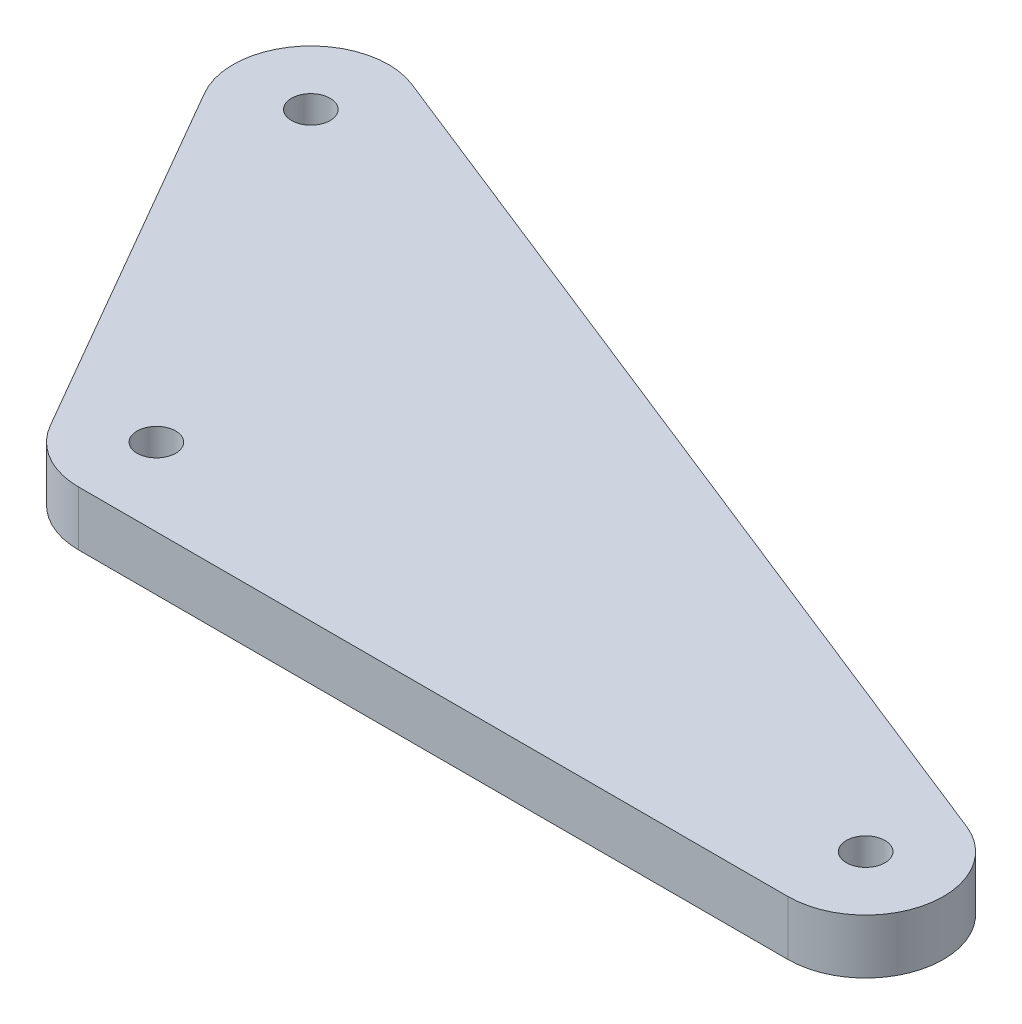
ISO-10303-21;
HEADER;
FILE_DESCRIPTION(('STEP AP214'),'2;1');
FILE_NAME('part.step','',(''),(''),'','','');
FILE_SCHEMA(('AUTOMOTIVE_DESIGN { 1 0 10303 214 1 1 1 1 }'));
ENDSEC;
DATA;
#1=APPLICATION_CONTEXT('core data for automotive mechanical design processes');
#2=APPLICATION_PROTOCOL_DEFINITION('international standard','automotive_design',2000,#1);
#3=PRODUCT_CONTEXT('',#1,'mechanical');
#4=PRODUCT('Part','Part','',(#3));
#5=PRODUCT_RELATED_PRODUCT_CATEGORY('part','',(#4));
#6=PRODUCT_DEFINITION_FORMATION('','',#4);
#7=PRODUCT_DEFINITION_CONTEXT('part definition',#1,'design');
#8=PRODUCT_DEFINITION('design','',#6,#7);
#9=PRODUCT_DEFINITION_SHAPE('','',#8);
#10=(LENGTH_UNIT() NAMED_UNIT(*) SI_UNIT(.MILLI.,.METRE.));
#11=(NAMED_UNIT(*) PLANE_ANGLE_UNIT() SI_UNIT($,.RADIAN.));
#12=(NAMED_UNIT(*) SI_UNIT($,.STERADIAN.) SOLID_ANGLE_UNIT());
#13=UNCERTAINTY_MEASURE_WITH_UNIT(LENGTH_MEASURE(1.E-05),#10,'distance_accuracy_value','');
#14=(GEOMETRIC_REPRESENTATION_CONTEXT(3) GLOBAL_UNCERTAINTY_ASSIGNED_CONTEXT((#13)) GLOBAL_UNIT_ASSIGNED_CONTEXT((#10,
#11,#12)) REPRESENTATION_CONTEXT('',''));
#15=CARTESIAN_POINT('',(0.,0.,0.));
#16=DIRECTION('',(0.,0.,1.));
#17=DIRECTION('',(1.,0.,0.));
#18=AXIS2_PLACEMENT_3D('',#15,#16,#17);
#19=CARTESIAN_POINT('',(-107.101555281038,6.35,-42.5245411515933));
#20=DIRECTION('',(0.,-1.,0.));
#21=DIRECTION('',(0.,0.,-1.));
#22=AXIS2_PLACEMENT_3D('',#19,#20,#21);
#23=CYLINDRICAL_SURFACE('',#22,9.04875);
#24=CARTESIAN_POINT('',(-107.101555281038,0.,-42.5245411515933));
#25=DIRECTION('',(0.,1.,0.));
#26=DIRECTION('',(0.,0.,1.));
#27=AXIS2_PLACEMENT_3D('',#24,#25,#26);
#28=CIRCLE('',#27,9.04875);
#29=CARTESIAN_POINT('',(-103.762341405601,0.,-50.9346260058974));
#30=VERTEX_POINT('',#29);
#31=CARTESIAN_POINT('',(-114.938002653532,0.,-38.0001661515934));
#32=VERTEX_POINT('',#31);
#33=EDGE_CURVE('E122',#30,#32,#28,.T.);
#34=ORIENTED_EDGE('',*,*,#33,.T.);
#35=DIRECTION('',(0.,-1.,0.));
#36=VECTOR('',#35,1.);
#37=CARTESIAN_POINT('',(-114.938002653532,6.35,-38.0001661515934));
#38=LINE('',#37,#36);
#39=CARTESIAN_POINT('',(-114.938002653532,6.35,-38.0001661515934));
#40=VERTEX_POINT('',#39);
#41=EDGE_CURVE('E11',#40,#32,#38,.T.);
#42=ORIENTED_EDGE('',*,*,#41,.F.);
#43=CARTESIAN_POINT('',(-107.101555281038,6.35,-42.5245411515933));
#44=DIRECTION('',(0.,1.,0.));
#45=DIRECTION('',(0.,0.,1.));
#46=AXIS2_PLACEMENT_3D('',#43,#44,#45);
#47=CIRCLE('',#46,9.04875);
#48=CARTESIAN_POINT('',(-103.762341405601,6.35,-50.9346260058974));
#49=VERTEX_POINT('',#48);
#50=EDGE_CURVE('E133',#49,#40,#47,.T.);
#51=ORIENTED_EDGE('',*,*,#50,.F.);
#52=DIRECTION('',(0.,-1.,0.));
#53=VECTOR('',#52,1.);
#54=CARTESIAN_POINT('',(-103.762341405601,6.35,-50.9346260058974));
#55=LINE('',#54,#53);
#56=EDGE_CURVE('E118',#49,#30,#55,.T.);
#57=ORIENTED_EDGE('',*,*,#56,.T.);
#58=EDGE_LOOP('',(#34,#42,#51,#57));
#59=FACE_BOUND('',#58,.T.);
#60=ADVANCED_FACE('F38',(#59),#23,.T.);
#61=CARTESIAN_POINT('',(-114.938002653532,6.35,-38.0001661515934));
#62=DIRECTION('',(0.86602540378444,0.,-0.499999999999997));
#63=DIRECTION('',(-0.499999999999998,0.,-0.86602540378444));
#64=AXIS2_PLACEMENT_3D('',#61,#62,#63);
#65=PLANE('',#64);
#66=DIRECTION('',(0.499999999999997,0.,0.86602540378444));
#67=VECTOR('',#66,1.);
#68=CARTESIAN_POINT('',(-114.938002653532,0.,-38.0001661515934));
#69=LINE('',#68,#67);
#70=CARTESIAN_POINT('',(-90.3864473724945,0.,4.52437499999998));
#71=VERTEX_POINT('',#70);
#72=EDGE_CURVE('E125',#32,#71,#69,.T.);
#73=ORIENTED_EDGE('',*,*,#72,.T.);
#74=DIRECTION('',(0.,-1.,0.));
#75=VECTOR('',#74,1.);
#76=CARTESIAN_POINT('',(-90.3864473724945,6.35,4.52437499999998));
#77=LINE('',#76,#75);
#78=CARTESIAN_POINT('',(-90.3864473724945,6.35,4.52437499999998));
#79=VERTEX_POINT('',#78);
#80=EDGE_CURVE('E46',#79,#71,#77,.T.);
#81=ORIENTED_EDGE('',*,*,#80,.F.);
#82=DIRECTION('',(0.499999999999997,0.,0.86602540378444));
#83=VECTOR('',#82,1.);
#84=CARTESIAN_POINT('',(-114.938002653532,6.35,-38.0001661515934));
#85=LINE('',#84,#83);
#86=EDGE_CURVE('E91',#40,#79,#85,.T.);
#87=ORIENTED_EDGE('',*,*,#86,.F.);
#88=ORIENTED_EDGE('',*,*,#41,.T.);
#89=EDGE_LOOP('',(#73,#81,#87,#88));
#90=FACE_BOUND('',#89,.T.);
#91=ADVANCED_FACE('F158',(#90),#65,.F.);
#92=CARTESIAN_POINT('',(-82.55,6.35,0.));
#93=DIRECTION('',(0.,-1.,0.));
#94=DIRECTION('',(0.,0.,-1.));
#95=AXIS2_PLACEMENT_3D('',#92,#93,#94);
#96=CYLINDRICAL_SURFACE('',#95,9.04875000000001);
#97=CARTESIAN_POINT('',(-82.55,0.,0.));
#98=DIRECTION('',(0.,1.,0.));
#99=DIRECTION('',(0.,0.,1.));
#100=AXIS2_PLACEMENT_3D('',#97,#98,#99);
#101=CIRCLE('',#100,9.04875000000001);
#102=CARTESIAN_POINT('',(-82.55,0.,9.04875000000001));
#103=VERTEX_POINT('',#102);
#104=EDGE_CURVE('E128',#71,#103,#101,.T.);
#105=ORIENTED_EDGE('',*,*,#104,.T.);
#106=DIRECTION('',(0.,-1.,0.));
#107=VECTOR('',#106,1.);
#108=CARTESIAN_POINT('',(-82.55,6.35,9.04875000000001));
#109=LINE('',#108,#107);
#110=CARTESIAN_POINT('',(-82.55,6.35,9.04875000000001));
#111=VERTEX_POINT('',#110);
#112=EDGE_CURVE('E113',#111,#103,#109,.T.);
#113=ORIENTED_EDGE('',*,*,#112,.F.);
#114=CARTESIAN_POINT('',(-82.55,6.35,0.));
#115=DIRECTION('',(0.,1.,0.));
#116=DIRECTION('',(0.,0.,1.));
#117=AXIS2_PLACEMENT_3D('',#114,#115,#116);
#118=CIRCLE('',#117,9.04875000000001);
#119=EDGE_CURVE('E104',#79,#111,#118,.T.);
#120=ORIENTED_EDGE('',*,*,#119,.F.);
#121=ORIENTED_EDGE('',*,*,#80,.T.);
#122=EDGE_LOOP('',(#105,#113,#120,#121));
#123=FACE_BOUND('',#122,.T.);
#124=ADVANCED_FACE('F139',(#123),#96,.T.);
#125=CARTESIAN_POINT('',(-82.55,6.35,9.04875000000001));
#126=DIRECTION('',(0.,0.,-1.));
#127=DIRECTION('',(-1.,0.,0.));
#128=AXIS2_PLACEMENT_3D('',#125,#126,#127);
#129=PLANE('',#128);
#130=DIRECTION('',(1.,0.,0.));
#131=VECTOR('',#130,1.);
#132=CARTESIAN_POINT('',(-82.55,0.,9.04875000000001));
#133=LINE('',#132,#131);
#134=CARTESIAN_POINT('',(-1.70841119029318E-13,0.,9.04874999999996));
#135=VERTEX_POINT('',#134);
#136=EDGE_CURVE('E112',#103,#135,#133,.T.);
#137=ORIENTED_EDGE('',*,*,#136,.T.);
#138=DIRECTION('',(0.,-1.,0.));
#139=VECTOR('',#138,1.);
#140=CARTESIAN_POINT('',(-1.70841119029318E-13,6.35,9.04874999999996));
#141=LINE('',#140,#139);
#142=CARTESIAN_POINT('',(-1.70841119029318E-13,6.35,9.04874999999996));
#143=VERTEX_POINT('',#142);
#144=EDGE_CURVE('E109',#143,#135,#141,.T.);
#145=ORIENTED_EDGE('',*,*,#144,.F.);
#146=DIRECTION('',(1.,0.,0.));
#147=VECTOR('',#146,1.);
#148=CARTESIAN_POINT('',(-82.55,6.35,9.04875000000001));
#149=LINE('',#148,#147);
#150=EDGE_CURVE('E98',#111,#143,#149,.T.);
#151=ORIENTED_EDGE('',*,*,#150,.F.);
#152=ORIENTED_EDGE('',*,*,#112,.T.);
#153=EDGE_LOOP('',(#137,#145,#151,#152));
#154=FACE_BOUND('',#153,.T.);
#155=ADVANCED_FACE('F110',(#154),#129,.F.);
#156=CARTESIAN_POINT('',(1.90819582357449E-13,6.35,0.));
#157=DIRECTION('',(0.,-1.,0.));
#158=DIRECTION('',(0.,0.,-1.));
#159=AXIS2_PLACEMENT_3D('',#156,#157,#158);
#160=CYLINDRICAL_SURFACE('',#159,9.04874999999997);
#161=CARTESIAN_POINT('',(1.90819582357449E-13,0.,0.));
#162=DIRECTION('',(0.,1.,0.));
#163=DIRECTION('',(0.,0.,1.));
#164=AXIS2_PLACEMENT_3D('',#161,#162,#163);
#165=CIRCLE('',#164,9.04874999999997);
#166=CARTESIAN_POINT('',(3.33921387543626,0.,-8.41008485430403));
#167=VERTEX_POINT('',#166);
#168=EDGE_CURVE('E77',#135,#167,#165,.T.);
#169=ORIENTED_EDGE('',*,*,#168,.T.);
#170=DIRECTION('',(0.,-1.,0.));
#171=VECTOR('',#170,1.);
#172=CARTESIAN_POINT('',(3.33921387543626,6.35,-8.41008485430403));
#173=LINE('',#172,#171);
#174=CARTESIAN_POINT('',(3.33921387543626,6.35,-8.41008485430403));
#175=VERTEX_POINT('',#174);
#176=EDGE_CURVE('E114',#175,#167,#173,.T.);
#177=ORIENTED_EDGE('',*,*,#176,.F.);
#178=CARTESIAN_POINT('',(1.90819582357449E-13,6.35,0.));
#179=DIRECTION('',(0.,1.,0.));
#180=DIRECTION('',(0.,0.,1.));
#181=AXIS2_PLACEMENT_3D('',#178,#179,#180);
#182=CIRCLE('',#181,9.04874999999997);
#183=EDGE_CURVE('E102',#143,#175,#182,.T.);
#184=ORIENTED_EDGE('',*,*,#183,.F.);
#185=ORIENTED_EDGE('',*,*,#144,.T.);
#186=EDGE_LOOP('',(#169,#177,#184,#185));
#187=FACE_BOUND('',#186,.T.);
#188=ADVANCED_FACE('F116',(#187),#160,.T.);
#189=CARTESIAN_POINT('',(-103.762341405601,6.35,-50.9346260058974));
#190=DIRECTION('',(-0.369024879175163,0.,0.929419516983454));
#191=DIRECTION('',(0.929419516983454,0.,0.369024879175163));
#192=AXIS2_PLACEMENT_3D('',#189,#190,#191);
#193=PLANE('',#192);
#194=DIRECTION('',(-0.929419516983454,0.,-0.369024879175163));
#195=VECTOR('',#194,1.);
#196=CARTESIAN_POINT('',(-103.762341405601,0.,-50.9346260058974));
#197=LINE('',#196,#195);
#198=EDGE_CURVE('E83',#167,#30,#197,.T.);
#199=ORIENTED_EDGE('',*,*,#198,.T.);
#200=ORIENTED_EDGE('',*,*,#56,.F.);
#201=DIRECTION('',(-0.929419516983454,0.,-0.369024879175163));
#202=VECTOR('',#201,1.);
#203=CARTESIAN_POINT('',(-103.762341405601,6.35,-50.9346260058974));
#204=LINE('',#203,#202);
#205=EDGE_CURVE('E54',#175,#49,#204,.T.);
#206=ORIENTED_EDGE('',*,*,#205,.F.);
#207=ORIENTED_EDGE('',*,*,#176,.T.);
#208=EDGE_LOOP('',(#199,#200,#206,#207));
#209=FACE_BOUND('',#208,.T.);
#210=ADVANCED_FACE('F146',(#209),#193,.F.);
#211=CARTESIAN_POINT('',(-107.101555281038,6.35,-42.5245411515933));
#212=DIRECTION('',(0.,1.,0.));
#213=DIRECTION('',(0.,0.,1.));
#214=AXIS2_PLACEMENT_3D('',#211,#212,#213);
#215=PLANE('',#214);
#216=CARTESIAN_POINT('',(-107.101555281038,6.35,-42.5245411515933));
#217=DIRECTION('',(0.,1.,0.));
#218=DIRECTION('',(0.,0.,1.));
#219=AXIS2_PLACEMENT_3D('',#216,#217,#218);
#220=CIRCLE('',#219,2.25);
#221=CARTESIAN_POINT('',(-107.101555281038,6.35,-40.2745411515933));
#222=VERTEX_POINT('',#221);
#223=EDGE_CURVE('E234',#222,#222,#220,.T.);
#224=ORIENTED_EDGE('',*,*,#223,.F.);
#225=EDGE_LOOP('',(#224));
#226=FACE_BOUND('',#225,.T.);
#227=CARTESIAN_POINT('',(-82.55,6.35,0.));
#228=DIRECTION('',(0.,1.,0.));
#229=DIRECTION('',(0.,0.,1.));
#230=AXIS2_PLACEMENT_3D('',#227,#228,#229);
#231=CIRCLE('',#230,2.25);
#232=CARTESIAN_POINT('',(-82.55,6.35,2.25));
#233=VERTEX_POINT('',#232);
#234=EDGE_CURVE('E236',#233,#233,#231,.T.);
#235=ORIENTED_EDGE('',*,*,#234,.F.);
#236=EDGE_LOOP('',(#235));
#237=FACE_BOUND('',#236,.T.);
#238=CARTESIAN_POINT('',(0.,6.35,0.));
#239=DIRECTION('',(0.,1.,0.));
#240=DIRECTION('',(0.,0.,1.));
#241=AXIS2_PLACEMENT_3D('',#238,#239,#240);
#242=CIRCLE('',#241,2.25);
#243=CARTESIAN_POINT('',(0.,6.35,2.25));
#244=VERTEX_POINT('',#243);
#245=EDGE_CURVE('E244',#244,#244,#242,.T.);
#246=ORIENTED_EDGE('',*,*,#245,.F.);
#247=EDGE_LOOP('',(#246));
#248=FACE_BOUND('',#247,.T.);
#249=ORIENTED_EDGE('',*,*,#50,.T.);
#250=ORIENTED_EDGE('',*,*,#86,.T.);
#251=ORIENTED_EDGE('',*,*,#119,.T.);
#252=ORIENTED_EDGE('',*,*,#150,.T.);
#253=ORIENTED_EDGE('',*,*,#183,.T.);
#254=ORIENTED_EDGE('',*,*,#205,.T.);
#255=EDGE_LOOP('',(#249,#250,#251,#252,#253,#254));
#256=FACE_BOUND('',#255,.T.);
#257=ADVANCED_FACE('F100',(#226,#237,#248,#256),#215,.T.);
#258=CARTESIAN_POINT('',(-107.101555281038,0.,-42.5245411515933));
#259=DIRECTION('',(0.,1.,0.));
#260=DIRECTION('',(0.,0.,1.));
#261=AXIS2_PLACEMENT_3D('',#258,#259,#260);
#262=PLANE('',#261);
#263=CARTESIAN_POINT('',(-107.101555281038,0.,-42.5245411515933));
#264=DIRECTION('',(0.,1.,0.));
#265=DIRECTION('',(0.,0.,1.));
#266=AXIS2_PLACEMENT_3D('',#263,#264,#265);
#267=CIRCLE('',#266,2.25);
#268=CARTESIAN_POINT('',(-107.101555281038,0.,-40.2745411515933));
#269=VERTEX_POINT('',#268);
#270=EDGE_CURVE('E231',#269,#269,#267,.T.);
#271=ORIENTED_EDGE('',*,*,#270,.T.);
#272=EDGE_LOOP('',(#271));
#273=FACE_BOUND('',#272,.T.);
#274=CARTESIAN_POINT('',(-82.55,0.,0.));
#275=DIRECTION('',(0.,1.,0.));
#276=DIRECTION('',(0.,0.,1.));
#277=AXIS2_PLACEMENT_3D('',#274,#275,#276);
#278=CIRCLE('',#277,2.25);
#279=CARTESIAN_POINT('',(-82.55,0.,2.25));
#280=VERTEX_POINT('',#279);
#281=EDGE_CURVE('E241',#280,#280,#278,.T.);
#282=ORIENTED_EDGE('',*,*,#281,.T.);
#283=EDGE_LOOP('',(#282));
#284=FACE_BOUND('',#283,.T.);
#285=CARTESIAN_POINT('',(0.,0.,0.));
#286=DIRECTION('',(0.,1.,0.));
#287=DIRECTION('',(0.,0.,1.));
#288=AXIS2_PLACEMENT_3D('',#285,#286,#287);
#289=CIRCLE('',#288,2.25);
#290=CARTESIAN_POINT('',(0.,0.,2.25));
#291=VERTEX_POINT('',#290);
#292=EDGE_CURVE('E126',#291,#291,#289,.T.);
#293=ORIENTED_EDGE('',*,*,#292,.T.);
#294=EDGE_LOOP('',(#293));
#295=FACE_BOUND('',#294,.T.);
#296=ORIENTED_EDGE('',*,*,#33,.F.);
#297=ORIENTED_EDGE('',*,*,#198,.F.);
#298=ORIENTED_EDGE('',*,*,#168,.F.);
#299=ORIENTED_EDGE('',*,*,#136,.F.);
#300=ORIENTED_EDGE('',*,*,#104,.F.);
#301=ORIENTED_EDGE('',*,*,#72,.F.);
#302=EDGE_LOOP('',(#296,#297,#298,#299,#300,#301));
#303=FACE_BOUND('',#302,.T.);
#304=ADVANCED_FACE('F142',(#273,#284,#295,#303),#262,.F.);
#305=CARTESIAN_POINT('',(0.,6.35,0.));
#306=DIRECTION('',(0.,1.,0.));
#307=DIRECTION('',(0.,0.,1.));
#308=AXIS2_PLACEMENT_3D('',#305,#306,#307);
#309=CYLINDRICAL_SURFACE('',#308,2.25);
#310=ORIENTED_EDGE('',*,*,#292,.F.);
#311=EDGE_LOOP('',(#310));
#312=FACE_BOUND('',#311,.T.);
#313=ORIENTED_EDGE('',*,*,#245,.T.);
#314=EDGE_LOOP('',(#313));
#315=FACE_BOUND('',#314,.T.);
#316=ADVANCED_FACE('F195',(#312,#315),#309,.F.);
#317=CARTESIAN_POINT('',(-82.55,6.35,0.));
#318=DIRECTION('',(0.,1.,0.));
#319=DIRECTION('',(0.,0.,1.));
#320=AXIS2_PLACEMENT_3D('',#317,#318,#319);
#321=CYLINDRICAL_SURFACE('',#320,2.25);
#322=ORIENTED_EDGE('',*,*,#281,.F.);
#323=EDGE_LOOP('',(#322));
#324=FACE_BOUND('',#323,.T.);
#325=ORIENTED_EDGE('',*,*,#234,.T.);
#326=EDGE_LOOP('',(#325));
#327=FACE_BOUND('',#326,.T.);
#328=ADVANCED_FACE('F204',(#324,#327),#321,.F.);
#329=CARTESIAN_POINT('',(-107.101555281038,6.35,-42.5245411515933));
#330=DIRECTION('',(0.,1.,0.));
#331=DIRECTION('',(0.,0.,1.));
#332=AXIS2_PLACEMENT_3D('',#329,#330,#331);
#333=CYLINDRICAL_SURFACE('',#332,2.25);
#334=ORIENTED_EDGE('',*,*,#270,.F.);
#335=EDGE_LOOP('',(#334));
#336=FACE_BOUND('',#335,.T.);
#337=ORIENTED_EDGE('',*,*,#223,.T.);
#338=EDGE_LOOP('',(#337));
#339=FACE_BOUND('',#338,.T.);
#340=ADVANCED_FACE('F214',(#336,#339),#333,.F.);
#341=CLOSED_SHELL('',(#60,#91,#124,#155,#188,#210,#257,#304,#316,#328,#340));
#342=MANIFOLD_SOLID_BREP('B2',#341);
#343=ADVANCED_BREP_SHAPE_REPRESENTATION('',(#18,#342),#14);
#344=SHAPE_DEFINITION_REPRESENTATION(#9,#343);
ENDSEC;
END-ISO-10303-21;
